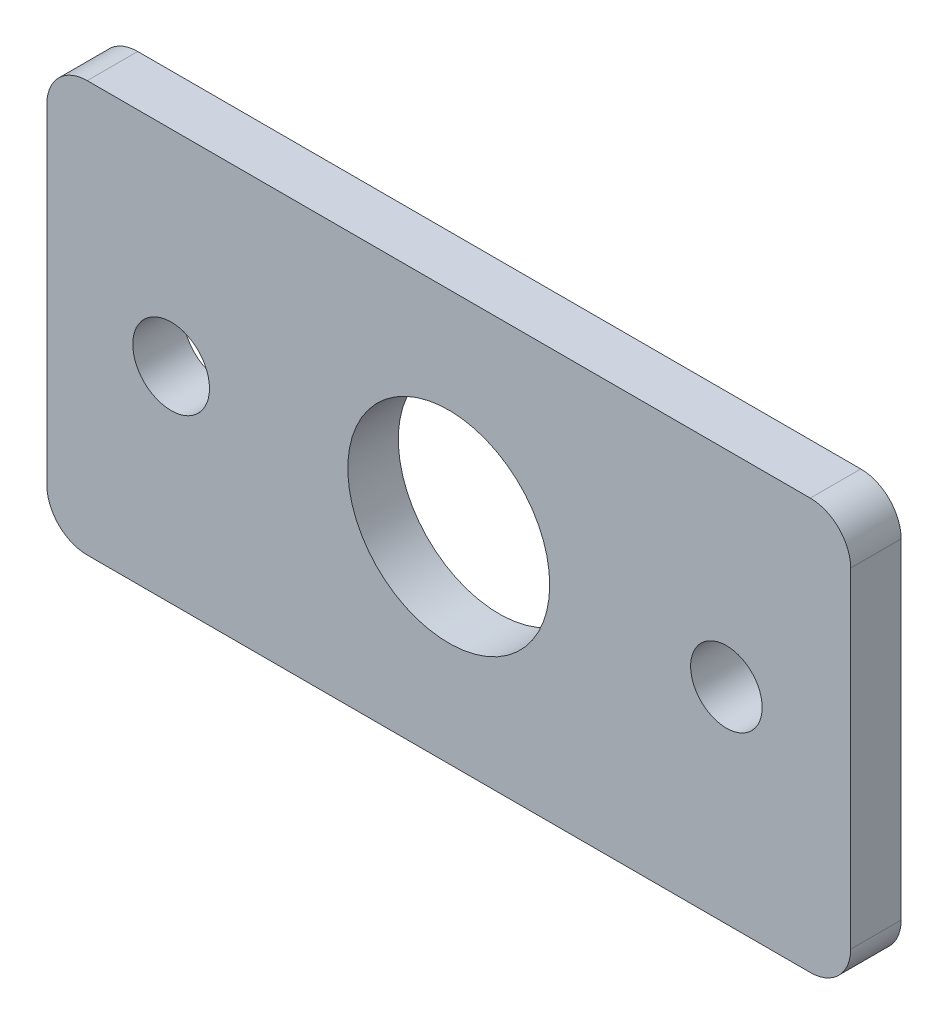
ISO-10303-21;
HEADER;
FILE_DESCRIPTION(('STEP AP214'),'2;1');
FILE_NAME('part.step','',(''),(''),'','','');
FILE_SCHEMA(('AUTOMOTIVE_DESIGN { 1 0 10303 214 1 1 1 1 }'));
ENDSEC;
DATA;
#1=APPLICATION_CONTEXT('core data for automotive mechanical design processes');
#2=APPLICATION_PROTOCOL_DEFINITION('international standard','automotive_design',2000,#1);
#3=PRODUCT_CONTEXT('',#1,'mechanical');
#4=PRODUCT('Part','Part','',(#3));
#5=PRODUCT_RELATED_PRODUCT_CATEGORY('part','',(#4));
#6=PRODUCT_DEFINITION_FORMATION('','',#4);
#7=PRODUCT_DEFINITION_CONTEXT('part definition',#1,'design');
#8=PRODUCT_DEFINITION('design','',#6,#7);
#9=PRODUCT_DEFINITION_SHAPE('','',#8);
#10=(LENGTH_UNIT() NAMED_UNIT(*) SI_UNIT(.MILLI.,.METRE.));
#11=(NAMED_UNIT(*) PLANE_ANGLE_UNIT() SI_UNIT($,.RADIAN.));
#12=(NAMED_UNIT(*) SI_UNIT($,.STERADIAN.) SOLID_ANGLE_UNIT());
#13=UNCERTAINTY_MEASURE_WITH_UNIT(LENGTH_MEASURE(1.E-05),#10,'distance_accuracy_value','');
#14=(GEOMETRIC_REPRESENTATION_CONTEXT(3) GLOBAL_UNCERTAINTY_ASSIGNED_CONTEXT((#13)) GLOBAL_UNIT_ASSIGNED_CONTEXT((#10,
#11,#12)) REPRESENTATION_CONTEXT('',''));
#15=CARTESIAN_POINT('',(0.,0.,0.));
#16=DIRECTION('',(0.,0.,1.));
#17=DIRECTION('',(1.,0.,0.));
#18=AXIS2_PLACEMENT_3D('',#15,#16,#17);
#19=CARTESIAN_POINT('',(0.,0.,3.175));
#20=DIRECTION('',(0.,0.,-1.));
#21=DIRECTION('',(-1.,0.,0.));
#22=AXIS2_PLACEMENT_3D('',#19,#20,#21);
#23=PLANE('',#22);
#24=CARTESIAN_POINT('',(17.4624999999576,9.1621155107191E-11,3.175));
#25=DIRECTION('',(0.,0.,1.));
#26=DIRECTION('',(1.,0.,0.));
#27=AXIS2_PLACEMENT_3D('',#24,#25,#26);
#28=CIRCLE('',#27,2.24976662870495);
#29=CARTESIAN_POINT('',(19.7122666286626,9.1621155107191E-11,3.175));
#30=VERTEX_POINT('',#29);
#31=EDGE_CURVE('E179',#30,#30,#28,.T.);
#32=ORIENTED_EDGE('',*,*,#31,.F.);
#33=EDGE_LOOP('',(#32));
#34=FACE_BOUND('',#33,.T.);
#35=DIRECTION('',(0.,-1.,0.));
#36=VECTOR('',#35,1.);
#37=CARTESIAN_POINT('',(-25.2778558296886,-12.9212908327685,3.175));
#38=LINE('',#37,#36);
#39=CARTESIAN_POINT('',(-25.2778558296886,10.3812908327721,3.175));
#40=VERTEX_POINT('',#39);
#41=CARTESIAN_POINT('',(-25.2778558296886,-10.3812908327685,3.175));
#42=VERTEX_POINT('',#41);
#43=EDGE_CURVE('E174',#40,#42,#38,.T.);
#44=ORIENTED_EDGE('',*,*,#43,.T.);
#45=CARTESIAN_POINT('',(-22.7378558296886,-10.3812908327685,3.175));
#46=DIRECTION('',(0.,0.,-1.));
#47=DIRECTION('',(-1.,0.,0.));
#48=AXIS2_PLACEMENT_3D('',#45,#46,#47);
#49=CIRCLE('',#48,2.54);
#50=CARTESIAN_POINT('',(-22.7378558296886,-12.9212908327685,3.175));
#51=VERTEX_POINT('',#50);
#52=EDGE_CURVE('E151',#42,#51,#49,.F.);
#53=ORIENTED_EDGE('',*,*,#52,.T.);
#54=DIRECTION('',(1.,0.,0.));
#55=VECTOR('',#54,1.);
#56=CARTESIAN_POINT('',(-25.2778558296886,-12.9212908327685,3.175));
#57=LINE('',#56,#55);
#58=CARTESIAN_POINT('',(22.737855829657,-12.9212908327685,3.175));
#59=VERTEX_POINT('',#58);
#60=EDGE_CURVE('E122',#51,#59,#57,.T.);
#61=ORIENTED_EDGE('',*,*,#60,.T.);
#62=CARTESIAN_POINT('',(22.737855829657,-10.3812908327685,3.175));
#63=DIRECTION('',(0.,0.,-1.));
#64=DIRECTION('',(-1.,0.,0.));
#65=AXIS2_PLACEMENT_3D('',#62,#63,#64);
#66=CIRCLE('',#65,2.54);
#67=CARTESIAN_POINT('',(25.277855829657,-10.3812908327685,3.175));
#68=VERTEX_POINT('',#67);
#69=EDGE_CURVE('E149',#59,#68,#66,.F.);
#70=ORIENTED_EDGE('',*,*,#69,.T.);
#71=DIRECTION('',(0.,1.,0.));
#72=VECTOR('',#71,1.);
#73=CARTESIAN_POINT('',(25.277855829657,-12.9212908327685,3.175));
#74=LINE('',#73,#72);
#75=CARTESIAN_POINT('',(25.277855829657,10.3812908327721,3.175));
#76=VERTEX_POINT('',#75);
#77=EDGE_CURVE('E129',#68,#76,#74,.T.);
#78=ORIENTED_EDGE('',*,*,#77,.T.);
#79=CARTESIAN_POINT('',(22.737855829657,10.3812908327721,3.175));
#80=DIRECTION('',(0.,0.,-1.));
#81=DIRECTION('',(-1.,0.,0.));
#82=AXIS2_PLACEMENT_3D('',#79,#80,#81);
#83=CIRCLE('',#82,2.54);
#84=CARTESIAN_POINT('',(22.737855829657,12.9212908327721,3.175));
#85=VERTEX_POINT('',#84);
#86=EDGE_CURVE('E57',#76,#85,#83,.F.);
#87=ORIENTED_EDGE('',*,*,#86,.T.);
#88=DIRECTION('',(-1.,0.,0.));
#89=VECTOR('',#88,1.);
#90=CARTESIAN_POINT('',(-25.2778558296886,12.9212908327721,3.175));
#91=LINE('',#90,#89);
#92=CARTESIAN_POINT('',(-22.7378558296886,12.9212908327721,3.175));
#93=VERTEX_POINT('',#92);
#94=EDGE_CURVE('E132',#85,#93,#91,.T.);
#95=ORIENTED_EDGE('',*,*,#94,.T.);
#96=CARTESIAN_POINT('',(-22.7378558296886,10.3812908327721,3.175));
#97=DIRECTION('',(0.,0.,-1.));
#98=DIRECTION('',(-1.,0.,0.));
#99=AXIS2_PLACEMENT_3D('',#96,#97,#98);
#100=CIRCLE('',#99,2.54);
#101=EDGE_CURVE('E146',#93,#40,#100,.F.);
#102=ORIENTED_EDGE('',*,*,#101,.T.);
#103=EDGE_LOOP('',(#44,#53,#61,#70,#78,#87,#95,#102));
#104=FACE_BOUND('',#103,.T.);
#105=CARTESIAN_POINT('',(-17.4625000000423,9.1621155107191E-11,3.175));
#106=DIRECTION('',(0.,0.,1.));
#107=DIRECTION('',(1.,0.,0.));
#108=AXIS2_PLACEMENT_3D('',#105,#106,#107);
#109=CIRCLE('',#108,2.413);
#110=CARTESIAN_POINT('',(-15.0495000000423,9.1621155107191E-11,3.175));
#111=VERTEX_POINT('',#110);
#112=EDGE_CURVE('E167',#111,#111,#109,.T.);
#113=ORIENTED_EDGE('',*,*,#112,.F.);
#114=EDGE_LOOP('',(#113));
#115=FACE_BOUND('',#114,.T.);
#116=CARTESIAN_POINT('',(-1.57651669496772E-11,1.83186799063151E-12,3.175));
#117=DIRECTION('',(0.,0.,1.));
#118=DIRECTION('',(1.,0.,0.));
#119=AXIS2_PLACEMENT_3D('',#116,#117,#118);
#120=CIRCLE('',#119,6.35);
#121=CARTESIAN_POINT('',(6.34999999998423,1.83186799063151E-12,3.175));
#122=VERTEX_POINT('',#121);
#123=EDGE_CURVE('E184',#122,#122,#120,.T.);
#124=ORIENTED_EDGE('',*,*,#123,.F.);
#125=EDGE_LOOP('',(#124));
#126=FACE_BOUND('',#125,.T.);
#127=ADVANCED_FACE('F36',(#34,#104,#115,#126),#23,.F.);
#128=CARTESIAN_POINT('',(0.,0.,0.));
#129=DIRECTION('',(0.,0.,-1.));
#130=DIRECTION('',(-1.,0.,0.));
#131=AXIS2_PLACEMENT_3D('',#128,#129,#130);
#132=PLANE('',#131);
#133=CARTESIAN_POINT('',(17.4624999999576,9.1621155107191E-11,0.));
#134=DIRECTION('',(0.,0.,1.));
#135=DIRECTION('',(1.,0.,0.));
#136=AXIS2_PLACEMENT_3D('',#133,#134,#135);
#137=CIRCLE('',#136,2.24976662870495);
#138=CARTESIAN_POINT('',(19.7122666286626,9.1621155107191E-11,0.));
#139=VERTEX_POINT('',#138);
#140=EDGE_CURVE('E181',#139,#139,#137,.T.);
#141=ORIENTED_EDGE('',*,*,#140,.T.);
#142=EDGE_LOOP('',(#141));
#143=FACE_BOUND('',#142,.T.);
#144=DIRECTION('',(1.,0.,0.));
#145=VECTOR('',#144,1.);
#146=CARTESIAN_POINT('',(-25.2778558296886,-12.9212908327685,0.));
#147=LINE('',#146,#145);
#148=CARTESIAN_POINT('',(-22.7378558296886,-12.9212908327685,0.));
#149=VERTEX_POINT('',#148);
#150=CARTESIAN_POINT('',(22.737855829657,-12.9212908327685,0.));
#151=VERTEX_POINT('',#150);
#152=EDGE_CURVE('E119',#149,#151,#147,.T.);
#153=ORIENTED_EDGE('',*,*,#152,.F.);
#154=CARTESIAN_POINT('',(-22.7378558296886,-10.3812908327685,0.));
#155=DIRECTION('',(0.,0.,-1.));
#156=DIRECTION('',(-1.,0.,0.));
#157=AXIS2_PLACEMENT_3D('',#154,#155,#156);
#158=CIRCLE('',#157,2.54);
#159=CARTESIAN_POINT('',(-25.2778558296886,-10.3812908327685,0.));
#160=VERTEX_POINT('',#159);
#161=EDGE_CURVE('E102',#149,#160,#158,.T.);
#162=ORIENTED_EDGE('',*,*,#161,.T.);
#163=DIRECTION('',(0.,-1.,0.));
#164=VECTOR('',#163,1.);
#165=CARTESIAN_POINT('',(-25.2778558296886,-12.9212908327685,0.));
#166=LINE('',#165,#164);
#167=CARTESIAN_POINT('',(-25.2778558296886,10.3812908327721,0.));
#168=VERTEX_POINT('',#167);
#169=EDGE_CURVE('E130',#168,#160,#166,.T.);
#170=ORIENTED_EDGE('',*,*,#169,.F.);
#171=CARTESIAN_POINT('',(-22.7378558296886,10.3812908327721,0.));
#172=DIRECTION('',(0.,0.,-1.));
#173=DIRECTION('',(-1.,0.,0.));
#174=AXIS2_PLACEMENT_3D('',#171,#172,#173);
#175=CIRCLE('',#174,2.54);
#176=CARTESIAN_POINT('',(-22.7378558296886,12.9212908327721,0.));
#177=VERTEX_POINT('',#176);
#178=EDGE_CURVE('E123',#168,#177,#175,.T.);
#179=ORIENTED_EDGE('',*,*,#178,.T.);
#180=DIRECTION('',(-1.,0.,0.));
#181=VECTOR('',#180,1.);
#182=CARTESIAN_POINT('',(-25.2778558296886,12.9212908327721,0.));
#183=LINE('',#182,#181);
#184=CARTESIAN_POINT('',(22.737855829657,12.9212908327721,0.));
#185=VERTEX_POINT('',#184);
#186=EDGE_CURVE('E134',#185,#177,#183,.T.);
#187=ORIENTED_EDGE('',*,*,#186,.F.);
#188=CARTESIAN_POINT('',(22.737855829657,10.3812908327721,0.));
#189=DIRECTION('',(0.,0.,-1.));
#190=DIRECTION('',(-1.,0.,0.));
#191=AXIS2_PLACEMENT_3D('',#188,#189,#190);
#192=CIRCLE('',#191,2.54);
#193=CARTESIAN_POINT('',(25.277855829657,10.3812908327721,0.));
#194=VERTEX_POINT('',#193);
#195=EDGE_CURVE('E140',#185,#194,#192,.T.);
#196=ORIENTED_EDGE('',*,*,#195,.T.);
#197=DIRECTION('',(0.,1.,0.));
#198=VECTOR('',#197,1.);
#199=CARTESIAN_POINT('',(25.277855829657,-12.9212908327685,0.));
#200=LINE('',#199,#198);
#201=CARTESIAN_POINT('',(25.277855829657,-10.3812908327685,0.));
#202=VERTEX_POINT('',#201);
#203=EDGE_CURVE('E162',#202,#194,#200,.T.);
#204=ORIENTED_EDGE('',*,*,#203,.F.);
#205=CARTESIAN_POINT('',(22.737855829657,-10.3812908327685,0.));
#206=DIRECTION('',(0.,0.,-1.));
#207=DIRECTION('',(-1.,0.,0.));
#208=AXIS2_PLACEMENT_3D('',#205,#206,#207);
#209=CIRCLE('',#208,2.54);
#210=EDGE_CURVE('E113',#202,#151,#209,.T.);
#211=ORIENTED_EDGE('',*,*,#210,.T.);
#212=EDGE_LOOP('',(#153,#162,#170,#179,#187,#196,#204,#211));
#213=FACE_BOUND('',#212,.T.);
#214=CARTESIAN_POINT('',(-17.4625000000423,9.1621155107191E-11,0.));
#215=DIRECTION('',(0.,0.,1.));
#216=DIRECTION('',(1.,0.,0.));
#217=AXIS2_PLACEMENT_3D('',#214,#215,#216);
#218=CIRCLE('',#217,2.413);
#219=CARTESIAN_POINT('',(-15.0495000000423,9.1621155107191E-11,0.));
#220=VERTEX_POINT('',#219);
#221=EDGE_CURVE('E170',#220,#220,#218,.T.);
#222=ORIENTED_EDGE('',*,*,#221,.T.);
#223=EDGE_LOOP('',(#222));
#224=FACE_BOUND('',#223,.T.);
#225=CARTESIAN_POINT('',(-1.57651669496772E-11,1.83186799063151E-12,0.));
#226=DIRECTION('',(0.,0.,1.));
#227=DIRECTION('',(1.,0.,0.));
#228=AXIS2_PLACEMENT_3D('',#225,#226,#227);
#229=CIRCLE('',#228,6.35);
#230=CARTESIAN_POINT('',(6.34999999998423,1.83186799063151E-12,0.));
#231=VERTEX_POINT('',#230);
#232=EDGE_CURVE('E187',#231,#231,#229,.T.);
#233=ORIENTED_EDGE('',*,*,#232,.T.);
#234=EDGE_LOOP('',(#233));
#235=FACE_BOUND('',#234,.T.);
#236=ADVANCED_FACE('F126',(#143,#213,#224,#235),#132,.T.);
#237=CARTESIAN_POINT('',(25.277855829657,-12.9212908327685,3.175));
#238=DIRECTION('',(-1.,0.,0.));
#239=DIRECTION('',(0.,0.,1.));
#240=AXIS2_PLACEMENT_3D('',#237,#238,#239);
#241=PLANE('',#240);
#242=ORIENTED_EDGE('',*,*,#77,.F.);
#243=DIRECTION('',(0.,0.,-1.));
#244=VECTOR('',#243,1.);
#245=CARTESIAN_POINT('',(25.277855829657,-10.3812908327685,3.175));
#246=LINE('',#245,#244);
#247=EDGE_CURVE('E155',#68,#202,#246,.T.);
#248=ORIENTED_EDGE('',*,*,#247,.T.);
#249=ORIENTED_EDGE('',*,*,#203,.T.);
#250=DIRECTION('',(0.,0.,-1.));
#251=VECTOR('',#250,1.);
#252=CARTESIAN_POINT('',(25.277855829657,10.3812908327721,3.175));
#253=LINE('',#252,#251);
#254=EDGE_CURVE('E153',#194,#76,#253,.F.);
#255=ORIENTED_EDGE('',*,*,#254,.T.);
#256=EDGE_LOOP('',(#242,#248,#249,#255));
#257=FACE_BOUND('',#256,.T.);
#258=ADVANCED_FACE('F161',(#257),#241,.F.);
#259=CARTESIAN_POINT('',(-25.2778558296886,12.9212908327721,3.175));
#260=DIRECTION('',(0.,-1.,0.));
#261=DIRECTION('',(0.,0.,-1.));
#262=AXIS2_PLACEMENT_3D('',#259,#260,#261);
#263=PLANE('',#262);
#264=ORIENTED_EDGE('',*,*,#94,.F.);
#265=DIRECTION('',(0.,0.,-1.));
#266=VECTOR('',#265,1.);
#267=CARTESIAN_POINT('',(22.737855829657,12.9212908327721,3.175));
#268=LINE('',#267,#266);
#269=EDGE_CURVE('E11',#85,#185,#268,.T.);
#270=ORIENTED_EDGE('',*,*,#269,.T.);
#271=ORIENTED_EDGE('',*,*,#186,.T.);
#272=DIRECTION('',(0.,0.,-1.));
#273=VECTOR('',#272,1.);
#274=CARTESIAN_POINT('',(-22.7378558296886,12.9212908327721,3.175));
#275=LINE('',#274,#273);
#276=EDGE_CURVE('E44',#177,#93,#275,.F.);
#277=ORIENTED_EDGE('',*,*,#276,.T.);
#278=EDGE_LOOP('',(#264,#270,#271,#277));
#279=FACE_BOUND('',#278,.T.);
#280=ADVANCED_FACE('F214',(#279),#263,.F.);
#281=CARTESIAN_POINT('',(-25.2778558296886,-12.9212908327685,3.175));
#282=DIRECTION('',(1.,0.,0.));
#283=DIRECTION('',(0.,0.,-1.));
#284=AXIS2_PLACEMENT_3D('',#281,#282,#283);
#285=PLANE('',#284);
#286=ORIENTED_EDGE('',*,*,#169,.T.);
#287=DIRECTION('',(0.,0.,-1.));
#288=VECTOR('',#287,1.);
#289=CARTESIAN_POINT('',(-25.2778558296886,-10.3812908327685,3.175));
#290=LINE('',#289,#288);
#291=EDGE_CURVE('E107',#160,#42,#290,.F.);
#292=ORIENTED_EDGE('',*,*,#291,.T.);
#293=ORIENTED_EDGE('',*,*,#43,.F.);
#294=DIRECTION('',(0.,0.,-1.));
#295=VECTOR('',#294,1.);
#296=CARTESIAN_POINT('',(-25.2778558296886,10.3812908327721,3.175));
#297=LINE('',#296,#295);
#298=EDGE_CURVE('E112',#40,#168,#297,.T.);
#299=ORIENTED_EDGE('',*,*,#298,.T.);
#300=EDGE_LOOP('',(#286,#292,#293,#299));
#301=FACE_BOUND('',#300,.T.);
#302=ADVANCED_FACE('F211',(#301),#285,.F.);
#303=CARTESIAN_POINT('',(-25.2778558296886,-12.9212908327685,3.175));
#304=DIRECTION('',(0.,1.,0.));
#305=DIRECTION('',(0.,0.,1.));
#306=AXIS2_PLACEMENT_3D('',#303,#304,#305);
#307=PLANE('',#306);
#308=ORIENTED_EDGE('',*,*,#60,.F.);
#309=DIRECTION('',(0.,0.,-1.));
#310=VECTOR('',#309,1.);
#311=CARTESIAN_POINT('',(-22.7378558296886,-12.9212908327685,3.175));
#312=LINE('',#311,#310);
#313=EDGE_CURVE('E106',#51,#149,#312,.T.);
#314=ORIENTED_EDGE('',*,*,#313,.T.);
#315=ORIENTED_EDGE('',*,*,#152,.T.);
#316=DIRECTION('',(0.,0.,-1.));
#317=VECTOR('',#316,1.);
#318=CARTESIAN_POINT('',(22.737855829657,-12.9212908327685,3.175));
#319=LINE('',#318,#317);
#320=EDGE_CURVE('E124',#151,#59,#319,.F.);
#321=ORIENTED_EDGE('',*,*,#320,.T.);
#322=EDGE_LOOP('',(#308,#314,#315,#321));
#323=FACE_BOUND('',#322,.T.);
#324=ADVANCED_FACE('F118',(#323),#307,.F.);
#325=CARTESIAN_POINT('',(-17.4625000000423,9.1621155107191E-11,3.175));
#326=DIRECTION('',(0.,0.,-1.));
#327=DIRECTION('',(-1.,0.,0.));
#328=AXIS2_PLACEMENT_3D('',#325,#326,#327);
#329=CYLINDRICAL_SURFACE('',#328,2.413);
#330=ORIENTED_EDGE('',*,*,#112,.T.);
#331=EDGE_LOOP('',(#330));
#332=FACE_BOUND('',#331,.T.);
#333=ORIENTED_EDGE('',*,*,#221,.F.);
#334=EDGE_LOOP('',(#333));
#335=FACE_BOUND('',#334,.T.);
#336=ADVANCED_FACE('F206',(#332,#335),#329,.F.);
#337=CARTESIAN_POINT('',(17.4624999999576,9.1621155107191E-11,3.175));
#338=DIRECTION('',(0.,0.,-1.));
#339=DIRECTION('',(-1.,0.,0.));
#340=AXIS2_PLACEMENT_3D('',#337,#338,#339);
#341=CYLINDRICAL_SURFACE('',#340,2.24976662870495);
#342=ORIENTED_EDGE('',*,*,#31,.T.);
#343=EDGE_LOOP('',(#342));
#344=FACE_BOUND('',#343,.T.);
#345=ORIENTED_EDGE('',*,*,#140,.F.);
#346=EDGE_LOOP('',(#345));
#347=FACE_BOUND('',#346,.T.);
#348=ADVANCED_FACE('F240',(#344,#347),#341,.F.);
#349=CARTESIAN_POINT('',(-1.57651669496772E-11,1.83186799063151E-12,3.175));
#350=DIRECTION('',(0.,0.,-1.));
#351=DIRECTION('',(-1.,0.,0.));
#352=AXIS2_PLACEMENT_3D('',#349,#350,#351);
#353=CYLINDRICAL_SURFACE('',#352,6.35);
#354=ORIENTED_EDGE('',*,*,#123,.T.);
#355=EDGE_LOOP('',(#354));
#356=FACE_BOUND('',#355,.T.);
#357=ORIENTED_EDGE('',*,*,#232,.F.);
#358=EDGE_LOOP('',(#357));
#359=FACE_BOUND('',#358,.T.);
#360=ADVANCED_FACE('F193',(#356,#359),#353,.F.);
#361=CARTESIAN_POINT('',(-22.7378558296886,-10.3812908327685,3.175));
#362=DIRECTION('',(0.,0.,-1.));
#363=DIRECTION('',(-1.,0.,0.));
#364=AXIS2_PLACEMENT_3D('',#361,#362,#363);
#365=CYLINDRICAL_SURFACE('',#364,2.54);
#366=ORIENTED_EDGE('',*,*,#52,.F.);
#367=ORIENTED_EDGE('',*,*,#291,.F.);
#368=ORIENTED_EDGE('',*,*,#161,.F.);
#369=ORIENTED_EDGE('',*,*,#313,.F.);
#370=EDGE_LOOP('',(#366,#367,#368,#369));
#371=FACE_BOUND('',#370,.T.);
#372=ADVANCED_FACE('F105',(#371),#365,.T.);
#373=CARTESIAN_POINT('',(22.737855829657,-10.3812908327685,3.175));
#374=DIRECTION('',(0.,0.,-1.));
#375=DIRECTION('',(-1.,0.,0.));
#376=AXIS2_PLACEMENT_3D('',#373,#374,#375);
#377=CYLINDRICAL_SURFACE('',#376,2.54);
#378=ORIENTED_EDGE('',*,*,#69,.F.);
#379=ORIENTED_EDGE('',*,*,#320,.F.);
#380=ORIENTED_EDGE('',*,*,#210,.F.);
#381=ORIENTED_EDGE('',*,*,#247,.F.);
#382=EDGE_LOOP('',(#378,#379,#380,#381));
#383=FACE_BOUND('',#382,.T.);
#384=ADVANCED_FACE('F222',(#383),#377,.T.);
#385=CARTESIAN_POINT('',(22.737855829657,10.3812908327721,3.175));
#386=DIRECTION('',(0.,0.,-1.));
#387=DIRECTION('',(-1.,0.,0.));
#388=AXIS2_PLACEMENT_3D('',#385,#386,#387);
#389=CYLINDRICAL_SURFACE('',#388,2.54);
#390=ORIENTED_EDGE('',*,*,#86,.F.);
#391=ORIENTED_EDGE('',*,*,#254,.F.);
#392=ORIENTED_EDGE('',*,*,#195,.F.);
#393=ORIENTED_EDGE('',*,*,#269,.F.);
#394=EDGE_LOOP('',(#390,#391,#392,#393));
#395=FACE_BOUND('',#394,.T.);
#396=ADVANCED_FACE('F224',(#395),#389,.T.);
#397=CARTESIAN_POINT('',(-22.7378558296886,10.3812908327721,3.175));
#398=DIRECTION('',(0.,0.,-1.));
#399=DIRECTION('',(-1.,0.,0.));
#400=AXIS2_PLACEMENT_3D('',#397,#398,#399);
#401=CYLINDRICAL_SURFACE('',#400,2.54);
#402=ORIENTED_EDGE('',*,*,#101,.F.);
#403=ORIENTED_EDGE('',*,*,#276,.F.);
#404=ORIENTED_EDGE('',*,*,#178,.F.);
#405=ORIENTED_EDGE('',*,*,#298,.F.);
#406=EDGE_LOOP('',(#402,#403,#404,#405));
#407=FACE_BOUND('',#406,.T.);
#408=ADVANCED_FACE('F38',(#407),#401,.T.);
#409=CLOSED_SHELL('',(#127,#236,#258,#280,#302,#324,#336,#348,#360,#372,#384,#396,#408));
#410=MANIFOLD_SOLID_BREP('B2',#409);
#411=ADVANCED_BREP_SHAPE_REPRESENTATION('',(#18,#410),#14);
#412=SHAPE_DEFINITION_REPRESENTATION(#9,#411);
ENDSEC;
END-ISO-10303-21;
